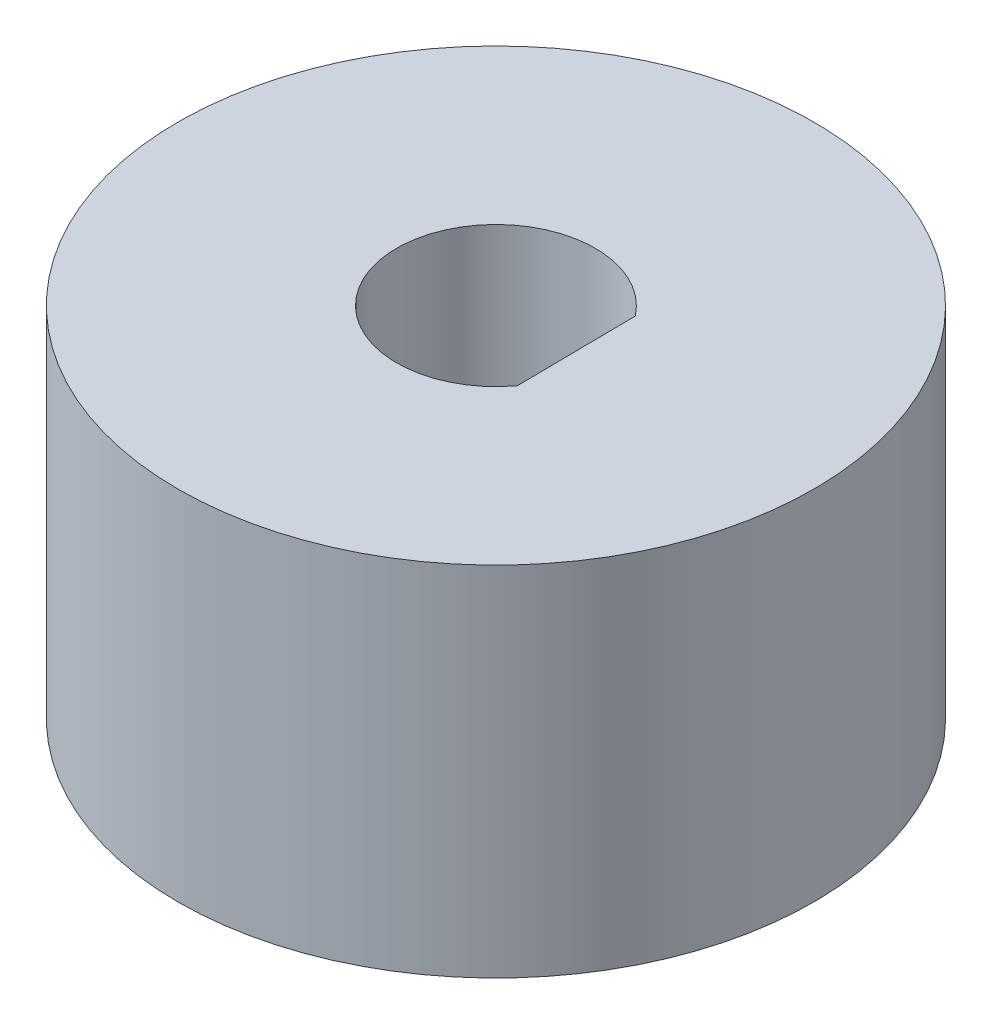
ISO-10303-21;
HEADER;
FILE_DESCRIPTION(('STEP AP214'),'2;1');
FILE_NAME('part.step','',(''),(''),'','','');
FILE_SCHEMA(('AUTOMOTIVE_DESIGN { 1 0 10303 214 1 1 1 1 }'));
ENDSEC;
DATA;
#1=APPLICATION_CONTEXT('core data for automotive mechanical design processes');
#2=APPLICATION_PROTOCOL_DEFINITION('international standard','automotive_design',2000,#1);
#3=PRODUCT_CONTEXT('',#1,'mechanical');
#4=PRODUCT('Part','Part','',(#3));
#5=PRODUCT_RELATED_PRODUCT_CATEGORY('part','',(#4));
#6=PRODUCT_DEFINITION_FORMATION('','',#4);
#7=PRODUCT_DEFINITION_CONTEXT('part definition',#1,'design');
#8=PRODUCT_DEFINITION('design','',#6,#7);
#9=PRODUCT_DEFINITION_SHAPE('','',#8);
#10=(LENGTH_UNIT() NAMED_UNIT(*) SI_UNIT(.MILLI.,.METRE.));
#11=(NAMED_UNIT(*) PLANE_ANGLE_UNIT() SI_UNIT($,.RADIAN.));
#12=(NAMED_UNIT(*) SI_UNIT($,.STERADIAN.) SOLID_ANGLE_UNIT());
#13=UNCERTAINTY_MEASURE_WITH_UNIT(LENGTH_MEASURE(1.E-05),#10,'distance_accuracy_value','');
#14=(GEOMETRIC_REPRESENTATION_CONTEXT(3) GLOBAL_UNCERTAINTY_ASSIGNED_CONTEXT((#13)) GLOBAL_UNIT_ASSIGNED_CONTEXT((#10,
#11,#12)) REPRESENTATION_CONTEXT('',''));
#15=CARTESIAN_POINT('',(0.,0.,0.));
#16=DIRECTION('',(0.,0.,1.));
#17=DIRECTION('',(1.,0.,0.));
#18=AXIS2_PLACEMENT_3D('',#15,#16,#17);
#19=CARTESIAN_POINT('',(0.,9.,0.));
#20=DIRECTION('',(0.,-1.,0.));
#21=DIRECTION('',(0.,0.,-1.));
#22=AXIS2_PLACEMENT_3D('',#19,#20,#21);
#23=CYLINDRICAL_SURFACE('',#22,8.);
#24=CARTESIAN_POINT('',(0.,9.,0.));
#25=DIRECTION('',(0.,1.,0.));
#26=DIRECTION('',(0.,0.,1.));
#27=AXIS2_PLACEMENT_3D('',#24,#25,#26);
#28=CIRCLE('',#27,8.);
#29=CARTESIAN_POINT('',(0.,9.,8.));
#30=VERTEX_POINT('',#29);
#31=EDGE_CURVE('E11',#30,#30,#28,.T.);
#32=ORIENTED_EDGE('',*,*,#31,.F.);
#33=EDGE_LOOP('',(#32));
#34=FACE_BOUND('',#33,.T.);
#35=CARTESIAN_POINT('',(0.,0.,0.));
#36=DIRECTION('',(0.,1.,0.));
#37=DIRECTION('',(0.,0.,1.));
#38=AXIS2_PLACEMENT_3D('',#35,#36,#37);
#39=CIRCLE('',#38,8.);
#40=CARTESIAN_POINT('',(0.,0.,8.));
#41=VERTEX_POINT('',#40);
#42=EDGE_CURVE('E40',#41,#41,#39,.T.);
#43=ORIENTED_EDGE('',*,*,#42,.T.);
#44=EDGE_LOOP('',(#43));
#45=FACE_BOUND('',#44,.T.);
#46=ADVANCED_FACE('F37',(#34,#45),#23,.T.);
#47=CARTESIAN_POINT('',(0.,9.,0.));
#48=DIRECTION('',(0.,1.,0.));
#49=DIRECTION('',(0.,0.,1.));
#50=AXIS2_PLACEMENT_3D('',#47,#48,#49);
#51=PLANE('',#50);
#52=CARTESIAN_POINT('',(0.,9.,0.));
#53=DIRECTION('',(0.,1.,0.));
#54=DIRECTION('',(0.,0.,-1.));
#55=AXIS2_PLACEMENT_3D('',#52,#53,#54);
#56=CIRCLE('',#55,2.5);
#57=CARTESIAN_POINT('',(1.98253738582249,9.,-1.52300542146642));
#58=VERTEX_POINT('',#57);
#59=CARTESIAN_POINT('',(2.01719567263806,9.,1.476794372379));
#60=VERTEX_POINT('',#59);
#61=EDGE_CURVE('E51',#58,#60,#56,.T.);
#62=ORIENTED_EDGE('',*,*,#61,.F.);
#63=DIRECTION('',(-0.0115527622718569,0.,-0.999933264615139));
#64=VECTOR('',#63,1.);
#65=CARTESIAN_POINT('',(1.98253738582249,9.,-1.52300542146642));
#66=LINE('',#65,#64);
#67=EDGE_CURVE('E70',#60,#58,#66,.T.);
#68=ORIENTED_EDGE('',*,*,#67,.F.);
#69=EDGE_LOOP('',(#62,#68));
#70=FACE_BOUND('',#69,.T.);
#71=ORIENTED_EDGE('',*,*,#31,.T.);
#72=EDGE_LOOP('',(#71));
#73=FACE_BOUND('',#72,.T.);
#74=ADVANCED_FACE('F74',(#70,#73),#51,.T.);
#75=CARTESIAN_POINT('',(0.,0.,0.));
#76=DIRECTION('',(0.,1.,0.));
#77=DIRECTION('',(0.,0.,1.));
#78=AXIS2_PLACEMENT_3D('',#75,#76,#77);
#79=PLANE('',#78);
#80=DIRECTION('',(-0.0115527622718569,0.,-0.999933264615139));
#81=VECTOR('',#80,1.);
#82=CARTESIAN_POINT('',(1.98253738582249,0.,-1.52300542146642));
#83=LINE('',#82,#81);
#84=CARTESIAN_POINT('',(2.01719567263806,0.,1.476794372379));
#85=VERTEX_POINT('',#84);
#86=CARTESIAN_POINT('',(1.98253738582249,0.,-1.52300542146642));
#87=VERTEX_POINT('',#86);
#88=EDGE_CURVE('E78',#85,#87,#83,.T.);
#89=ORIENTED_EDGE('',*,*,#88,.T.);
#90=CARTESIAN_POINT('',(0.,0.,0.));
#91=DIRECTION('',(0.,1.,0.));
#92=DIRECTION('',(0.,0.,-1.));
#93=AXIS2_PLACEMENT_3D('',#90,#91,#92);
#94=CIRCLE('',#93,2.5);
#95=EDGE_CURVE('E56',#87,#85,#94,.T.);
#96=ORIENTED_EDGE('',*,*,#95,.T.);
#97=EDGE_LOOP('',(#89,#96));
#98=FACE_BOUND('',#97,.T.);
#99=ORIENTED_EDGE('',*,*,#42,.F.);
#100=EDGE_LOOP('',(#99));
#101=FACE_BOUND('',#100,.T.);
#102=ADVANCED_FACE('F82',(#98,#101),#79,.F.);
#103=CARTESIAN_POINT('',(0.,0.,0.));
#104=DIRECTION('',(0.,1.,0.));
#105=DIRECTION('',(0.,0.,1.));
#106=AXIS2_PLACEMENT_3D('',#103,#104,#105);
#107=CYLINDRICAL_SURFACE('',#106,2.5);
#108=ORIENTED_EDGE('',*,*,#61,.T.);
#109=DIRECTION('',(0.,1.,0.));
#110=VECTOR('',#109,1.);
#111=CARTESIAN_POINT('',(2.01719567263806,0.,1.476794372379));
#112=LINE('',#111,#110);
#113=EDGE_CURVE('E67',#85,#60,#112,.T.);
#114=ORIENTED_EDGE('',*,*,#113,.F.);
#115=ORIENTED_EDGE('',*,*,#95,.F.);
#116=DIRECTION('',(0.,1.,0.));
#117=VECTOR('',#116,1.);
#118=CARTESIAN_POINT('',(1.98253738582249,0.,-1.52300542146642));
#119=LINE('',#118,#117);
#120=EDGE_CURVE('E61',#87,#58,#119,.T.);
#121=ORIENTED_EDGE('',*,*,#120,.T.);
#122=EDGE_LOOP('',(#108,#114,#115,#121));
#123=FACE_BOUND('',#122,.T.);
#124=ADVANCED_FACE('F63',(#123),#107,.F.);
#125=CARTESIAN_POINT('',(1.98253738582249,0.,-1.52300542146642));
#126=DIRECTION('',(0.999933264615139,0.,-0.0115527622718569));
#127=DIRECTION('',(-0.0115527622718569,0.,-0.999933264615139));
#128=AXIS2_PLACEMENT_3D('',#125,#126,#127);
#129=PLANE('',#128);
#130=ORIENTED_EDGE('',*,*,#67,.T.);
#131=ORIENTED_EDGE('',*,*,#120,.F.);
#132=ORIENTED_EDGE('',*,*,#88,.F.);
#133=ORIENTED_EDGE('',*,*,#113,.T.);
#134=EDGE_LOOP('',(#130,#131,#132,#133));
#135=FACE_BOUND('',#134,.T.);
#136=ADVANCED_FACE('F71',(#135),#129,.F.);
#137=CLOSED_SHELL('',(#46,#74,#102,#124,#136));
#138=MANIFOLD_SOLID_BREP('B2',#137);
#139=ADVANCED_BREP_SHAPE_REPRESENTATION('',(#18,#138),#14);
#140=SHAPE_DEFINITION_REPRESENTATION(#9,#139);
ENDSEC;
END-ISO-10303-21;
